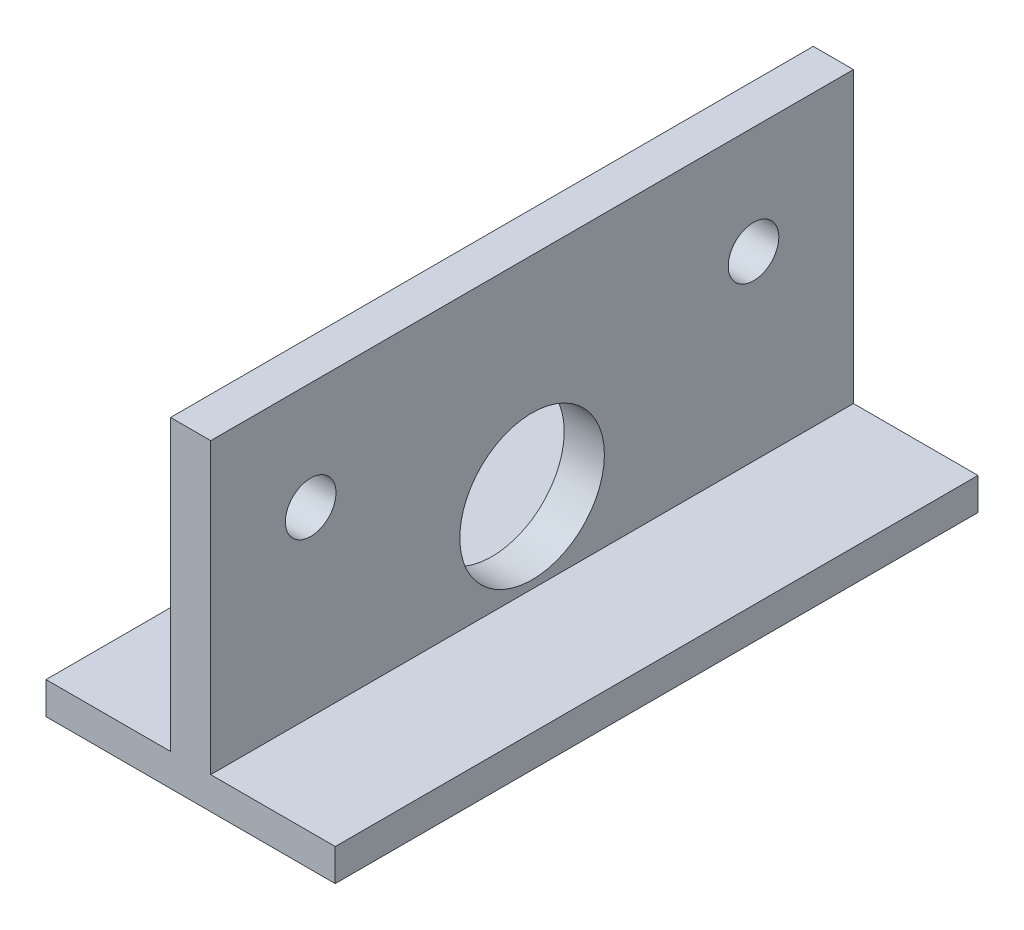
ISO-10303-21;
HEADER;
FILE_DESCRIPTION(('STEP AP214'),'2;1');
FILE_NAME('part.step','',(''),(''),'','','');
FILE_SCHEMA(('AUTOMOTIVE_DESIGN { 1 0 10303 214 1 1 1 1 }'));
ENDSEC;
DATA;
#1=APPLICATION_CONTEXT('core data for automotive mechanical design processes');
#2=APPLICATION_PROTOCOL_DEFINITION('international standard','automotive_design',2000,#1);
#3=PRODUCT_CONTEXT('',#1,'mechanical');
#4=PRODUCT('Part','Part','',(#3));
#5=PRODUCT_RELATED_PRODUCT_CATEGORY('part','',(#4));
#6=PRODUCT_DEFINITION_FORMATION('','',#4);
#7=PRODUCT_DEFINITION_CONTEXT('part definition',#1,'design');
#8=PRODUCT_DEFINITION('design','',#6,#7);
#9=PRODUCT_DEFINITION_SHAPE('','',#8);
#10=(LENGTH_UNIT() NAMED_UNIT(*) SI_UNIT(.MILLI.,.METRE.));
#11=(NAMED_UNIT(*) PLANE_ANGLE_UNIT() SI_UNIT($,.RADIAN.));
#12=(NAMED_UNIT(*) SI_UNIT($,.STERADIAN.) SOLID_ANGLE_UNIT());
#13=UNCERTAINTY_MEASURE_WITH_UNIT(LENGTH_MEASURE(1.E-05),#10,'distance_accuracy_value','');
#14=(GEOMETRIC_REPRESENTATION_CONTEXT(3) GLOBAL_UNCERTAINTY_ASSIGNED_CONTEXT((#13)) GLOBAL_UNIT_ASSIGNED_CONTEXT((#10,
#11,#12)) REPRESENTATION_CONTEXT('',''));
#15=CARTESIAN_POINT('',(0.,0.,0.));
#16=DIRECTION('',(0.,0.,1.));
#17=DIRECTION('',(1.,0.,0.));
#18=AXIS2_PLACEMENT_3D('',#15,#16,#17);
#19=CARTESIAN_POINT('',(1.5875,0.,0.));
#20=DIRECTION('',(-1.,0.,0.));
#21=DIRECTION('',(0.,0.,1.));
#22=AXIS2_PLACEMENT_3D('',#19,#20,#21);
#23=PLANE('',#22);
#24=CARTESIAN_POINT('',(1.5875,-3.81,0.));
#25=DIRECTION('',(1.,0.,0.));
#26=DIRECTION('',(0.,0.,-1.));
#27=AXIS2_PLACEMENT_3D('',#24,#25,#26);
#28=CIRCLE('',#27,5.715);
#29=CARTESIAN_POINT('',(1.5875,-3.81,-5.715));
#30=VERTEX_POINT('',#29);
#31=EDGE_CURVE('E133',#30,#30,#28,.T.);
#32=ORIENTED_EDGE('',*,*,#31,.F.);
#33=EDGE_LOOP('',(#32));
#34=FACE_BOUND('',#33,.T.);
#35=CARTESIAN_POINT('',(1.5875,4.191,-17.5006));
#36=DIRECTION('',(1.,0.,0.));
#37=DIRECTION('',(0.,0.,-1.));
#38=AXIS2_PLACEMENT_3D('',#35,#36,#37);
#39=CIRCLE('',#38,2.00025);
#40=CARTESIAN_POINT('',(1.5875,4.191,-19.50085));
#41=VERTEX_POINT('',#40);
#42=EDGE_CURVE('E139',#41,#41,#39,.T.);
#43=ORIENTED_EDGE('',*,*,#42,.F.);
#44=EDGE_LOOP('',(#43));
#45=FACE_BOUND('',#44,.T.);
#46=CARTESIAN_POINT('',(1.5875,4.191,17.5006));
#47=DIRECTION('',(1.,0.,0.));
#48=DIRECTION('',(0.,0.,-1.));
#49=AXIS2_PLACEMENT_3D('',#46,#47,#48);
#50=CIRCLE('',#49,2.00025);
#51=CARTESIAN_POINT('',(1.5875,4.191,15.50035));
#52=VERTEX_POINT('',#51);
#53=EDGE_CURVE('E145',#52,#52,#50,.T.);
#54=ORIENTED_EDGE('',*,*,#53,.F.);
#55=EDGE_LOOP('',(#54));
#56=FACE_BOUND('',#55,.T.);
#57=DIRECTION('',(0.,0.,1.));
#58=VECTOR('',#57,1.);
#59=CARTESIAN_POINT('',(1.5875,-10.16,0.));
#60=LINE('',#59,#58);
#61=CARTESIAN_POINT('',(1.5875,-10.16,-25.4));
#62=VERTEX_POINT('',#61);
#63=CARTESIAN_POINT('',(1.5875,-10.16,25.4));
#64=VERTEX_POINT('',#63);
#65=EDGE_CURVE('E52',#62,#64,#60,.T.);
#66=ORIENTED_EDGE('',*,*,#65,.F.);
#67=DIRECTION('',(0.,1.,0.));
#68=VECTOR('',#67,1.);
#69=CARTESIAN_POINT('',(1.5875,-12.7,-25.4));
#70=LINE('',#69,#68);
#71=CARTESIAN_POINT('',(1.5875,12.7,-25.4));
#72=VERTEX_POINT('',#71);
#73=EDGE_CURVE('E122',#62,#72,#70,.T.);
#74=ORIENTED_EDGE('',*,*,#73,.T.);
#75=DIRECTION('',(0.,0.,1.));
#76=VECTOR('',#75,1.);
#77=CARTESIAN_POINT('',(1.5875,12.7,25.4));
#78=LINE('',#77,#76);
#79=CARTESIAN_POINT('',(1.5875,12.7,25.4));
#80=VERTEX_POINT('',#79);
#81=EDGE_CURVE('E152',#72,#80,#78,.T.);
#82=ORIENTED_EDGE('',*,*,#81,.T.);
#83=DIRECTION('',(0.,-1.,0.));
#84=VECTOR('',#83,1.);
#85=CARTESIAN_POINT('',(1.5875,-12.7,25.4));
#86=LINE('',#85,#84);
#87=EDGE_CURVE('E57',#80,#64,#86,.T.);
#88=ORIENTED_EDGE('',*,*,#87,.T.);
#89=EDGE_LOOP('',(#66,#74,#82,#88));
#90=FACE_BOUND('',#89,.T.);
#91=ADVANCED_FACE('F37',(#34,#45,#56,#90),#23,.F.);
#92=CARTESIAN_POINT('',(-1.5875,0.,0.));
#93=DIRECTION('',(-1.,0.,0.));
#94=DIRECTION('',(0.,0.,1.));
#95=AXIS2_PLACEMENT_3D('',#92,#93,#94);
#96=PLANE('',#95);
#97=CARTESIAN_POINT('',(-1.5875,4.191,-17.5006));
#98=DIRECTION('',(1.,0.,0.));
#99=DIRECTION('',(0.,0.,-1.));
#100=AXIS2_PLACEMENT_3D('',#97,#98,#99);
#101=CIRCLE('',#100,2.00025);
#102=CARTESIAN_POINT('',(-1.5875,4.191,-19.50085));
#103=VERTEX_POINT('',#102);
#104=EDGE_CURVE('E136',#103,#103,#101,.T.);
#105=ORIENTED_EDGE('',*,*,#104,.T.);
#106=EDGE_LOOP('',(#105));
#107=FACE_BOUND('',#106,.T.);
#108=CARTESIAN_POINT('',(-1.5875,4.191,17.5006));
#109=DIRECTION('',(1.,0.,0.));
#110=DIRECTION('',(0.,0.,-1.));
#111=AXIS2_PLACEMENT_3D('',#108,#109,#110);
#112=CIRCLE('',#111,2.00025);
#113=CARTESIAN_POINT('',(-1.5875,4.191,15.50035));
#114=VERTEX_POINT('',#113);
#115=EDGE_CURVE('E142',#114,#114,#112,.T.);
#116=ORIENTED_EDGE('',*,*,#115,.T.);
#117=EDGE_LOOP('',(#116));
#118=FACE_BOUND('',#117,.T.);
#119=CARTESIAN_POINT('',(-1.5875,-3.81,0.));
#120=DIRECTION('',(1.,0.,0.));
#121=DIRECTION('',(0.,0.,-1.));
#122=AXIS2_PLACEMENT_3D('',#119,#120,#121);
#123=CIRCLE('',#122,5.715);
#124=CARTESIAN_POINT('',(-1.5875,-3.81,-5.715));
#125=VERTEX_POINT('',#124);
#126=EDGE_CURVE('E132',#125,#125,#123,.T.);
#127=ORIENTED_EDGE('',*,*,#126,.T.);
#128=EDGE_LOOP('',(#127));
#129=FACE_BOUND('',#128,.T.);
#130=DIRECTION('',(0.,1.,0.));
#131=VECTOR('',#130,1.);
#132=CARTESIAN_POINT('',(-1.5875,-12.7,-25.4));
#133=LINE('',#132,#131);
#134=CARTESIAN_POINT('',(-1.5875,-10.16,-25.4));
#135=VERTEX_POINT('',#134);
#136=CARTESIAN_POINT('',(-1.5875,12.7,-25.4));
#137=VERTEX_POINT('',#136);
#138=EDGE_CURVE('E148',#135,#137,#133,.T.);
#139=ORIENTED_EDGE('',*,*,#138,.F.);
#140=DIRECTION('',(0.,0.,1.));
#141=VECTOR('',#140,1.);
#142=CARTESIAN_POINT('',(-1.5875,-10.16,0.));
#143=LINE('',#142,#141);
#144=CARTESIAN_POINT('',(-1.5875,-10.16,25.4));
#145=VERTEX_POINT('',#144);
#146=EDGE_CURVE('E123',#135,#145,#143,.T.);
#147=ORIENTED_EDGE('',*,*,#146,.T.);
#148=DIRECTION('',(0.,-1.,0.));
#149=VECTOR('',#148,1.);
#150=CARTESIAN_POINT('',(-1.5875,-12.7,25.4));
#151=LINE('',#150,#149);
#152=CARTESIAN_POINT('',(-1.5875,12.7,25.4));
#153=VERTEX_POINT('',#152);
#154=EDGE_CURVE('E153',#153,#145,#151,.T.);
#155=ORIENTED_EDGE('',*,*,#154,.F.);
#156=DIRECTION('',(0.,0.,1.));
#157=VECTOR('',#156,1.);
#158=CARTESIAN_POINT('',(-1.5875,12.7,25.4));
#159=LINE('',#158,#157);
#160=EDGE_CURVE('E158',#137,#153,#159,.T.);
#161=ORIENTED_EDGE('',*,*,#160,.F.);
#162=EDGE_LOOP('',(#139,#147,#155,#161));
#163=FACE_BOUND('',#162,.T.);
#164=ADVANCED_FACE('F174',(#107,#118,#129,#163),#96,.T.);
#165=CARTESIAN_POINT('',(1.5875,-12.7,-25.4));
#166=DIRECTION('',(0.,0.,1.));
#167=DIRECTION('',(1.,0.,0.));
#168=AXIS2_PLACEMENT_3D('',#165,#166,#167);
#169=PLANE('',#168);
#170=DIRECTION('',(-1.,0.,0.));
#171=VECTOR('',#170,1.);
#172=CARTESIAN_POINT('',(1.5875,-12.7,-25.4));
#173=LINE('',#172,#171);
#174=CARTESIAN_POINT('',(11.43,-12.7,-25.4));
#175=VERTEX_POINT('',#174);
#176=CARTESIAN_POINT('',(-11.43,-12.7,-25.4));
#177=VERTEX_POINT('',#176);
#178=EDGE_CURVE('E156',#175,#177,#173,.T.);
#179=ORIENTED_EDGE('',*,*,#178,.T.);
#180=DIRECTION('',(0.,1.,0.));
#181=VECTOR('',#180,1.);
#182=CARTESIAN_POINT('',(-11.43,-10.16,-25.4));
#183=LINE('',#182,#181);
#184=CARTESIAN_POINT('',(-11.43,-10.16,-25.4));
#185=VERTEX_POINT('',#184);
#186=EDGE_CURVE('E183',#177,#185,#183,.T.);
#187=ORIENTED_EDGE('',*,*,#186,.T.);
#188=DIRECTION('',(-1.,0.,0.));
#189=VECTOR('',#188,1.);
#190=CARTESIAN_POINT('',(11.43,-10.16,-25.4));
#191=LINE('',#190,#189);
#192=EDGE_CURVE('E124',#135,#185,#191,.T.);
#193=ORIENTED_EDGE('',*,*,#192,.F.);
#194=ORIENTED_EDGE('',*,*,#138,.T.);
#195=DIRECTION('',(-1.,0.,0.));
#196=VECTOR('',#195,1.);
#197=CARTESIAN_POINT('',(1.5875,12.7,-25.4));
#198=LINE('',#197,#196);
#199=EDGE_CURVE('E11',#72,#137,#198,.T.);
#200=ORIENTED_EDGE('',*,*,#199,.F.);
#201=ORIENTED_EDGE('',*,*,#73,.F.);
#202=CARTESIAN_POINT('',(11.43,-10.16,-25.4));
#203=VERTEX_POINT('',#202);
#204=EDGE_CURVE('E104',#203,#62,#191,.T.);
#205=ORIENTED_EDGE('',*,*,#204,.F.);
#206=DIRECTION('',(0.,1.,0.));
#207=VECTOR('',#206,1.);
#208=CARTESIAN_POINT('',(11.43,-10.16,-25.4));
#209=LINE('',#208,#207);
#210=EDGE_CURVE('E111',#175,#203,#209,.T.);
#211=ORIENTED_EDGE('',*,*,#210,.F.);
#212=EDGE_LOOP('',(#179,#187,#193,#194,#200,#201,#205,#211));
#213=FACE_BOUND('',#212,.T.);
#214=ADVANCED_FACE('F39',(#213),#169,.F.);
#215=CARTESIAN_POINT('',(1.5875,12.7,25.4));
#216=DIRECTION('',(0.,-1.,0.));
#217=DIRECTION('',(0.,0.,-1.));
#218=AXIS2_PLACEMENT_3D('',#215,#216,#217);
#219=PLANE('',#218);
#220=ORIENTED_EDGE('',*,*,#160,.T.);
#221=DIRECTION('',(-1.,0.,0.));
#222=VECTOR('',#221,1.);
#223=CARTESIAN_POINT('',(1.5875,12.7,25.4));
#224=LINE('',#223,#222);
#225=EDGE_CURVE('E45',#80,#153,#224,.T.);
#226=ORIENTED_EDGE('',*,*,#225,.F.);
#227=ORIENTED_EDGE('',*,*,#81,.F.);
#228=ORIENTED_EDGE('',*,*,#199,.T.);
#229=EDGE_LOOP('',(#220,#226,#227,#228));
#230=FACE_BOUND('',#229,.T.);
#231=ADVANCED_FACE('F228',(#230),#219,.F.);
#232=CARTESIAN_POINT('',(1.5875,-12.7,25.4));
#233=DIRECTION('',(0.,0.,-1.));
#234=DIRECTION('',(-1.,0.,0.));
#235=AXIS2_PLACEMENT_3D('',#232,#233,#234);
#236=PLANE('',#235);
#237=DIRECTION('',(-1.,0.,0.));
#238=VECTOR('',#237,1.);
#239=CARTESIAN_POINT('',(1.5875,-12.7,25.4));
#240=LINE('',#239,#238);
#241=CARTESIAN_POINT('',(11.43,-12.7,25.4));
#242=VERTEX_POINT('',#241);
#243=CARTESIAN_POINT('',(-11.43,-12.7,25.4));
#244=VERTEX_POINT('',#243);
#245=EDGE_CURVE('E163',#242,#244,#240,.T.);
#246=ORIENTED_EDGE('',*,*,#245,.F.);
#247=DIRECTION('',(0.,-1.,0.));
#248=VECTOR('',#247,1.);
#249=CARTESIAN_POINT('',(11.43,-10.16,25.4));
#250=LINE('',#249,#248);
#251=CARTESIAN_POINT('',(11.43,-10.16,25.4));
#252=VERTEX_POINT('',#251);
#253=EDGE_CURVE('E110',#252,#242,#250,.T.);
#254=ORIENTED_EDGE('',*,*,#253,.F.);
#255=DIRECTION('',(-1.,0.,0.));
#256=VECTOR('',#255,1.);
#257=CARTESIAN_POINT('',(11.43,-10.16,25.4));
#258=LINE('',#257,#256);
#259=EDGE_CURVE('E106',#252,#64,#258,.T.);
#260=ORIENTED_EDGE('',*,*,#259,.T.);
#261=ORIENTED_EDGE('',*,*,#87,.F.);
#262=ORIENTED_EDGE('',*,*,#225,.T.);
#263=ORIENTED_EDGE('',*,*,#154,.T.);
#264=CARTESIAN_POINT('',(-11.43,-10.16,25.4));
#265=VERTEX_POINT('',#264);
#266=EDGE_CURVE('E180',#145,#265,#258,.T.);
#267=ORIENTED_EDGE('',*,*,#266,.T.);
#268=DIRECTION('',(0.,-1.,0.));
#269=VECTOR('',#268,1.);
#270=CARTESIAN_POINT('',(-11.43,-10.16,25.4));
#271=LINE('',#270,#269);
#272=EDGE_CURVE('E189',#265,#244,#271,.T.);
#273=ORIENTED_EDGE('',*,*,#272,.T.);
#274=EDGE_LOOP('',(#246,#254,#260,#261,#262,#263,#267,#273));
#275=FACE_BOUND('',#274,.T.);
#276=ADVANCED_FACE('F168',(#275),#236,.F.);
#277=CARTESIAN_POINT('',(1.5875,-12.7,25.4));
#278=DIRECTION('',(0.,1.,0.));
#279=DIRECTION('',(0.,0.,1.));
#280=AXIS2_PLACEMENT_3D('',#277,#278,#279);
#281=PLANE('',#280);
#282=ORIENTED_EDGE('',*,*,#245,.T.);
#283=DIRECTION('',(0.,0.,-1.));
#284=VECTOR('',#283,1.);
#285=CARTESIAN_POINT('',(-11.43,-12.7,25.4));
#286=LINE('',#285,#284);
#287=EDGE_CURVE('E119',#244,#177,#286,.T.);
#288=ORIENTED_EDGE('',*,*,#287,.T.);
#289=ORIENTED_EDGE('',*,*,#178,.F.);
#290=DIRECTION('',(0.,0.,-1.));
#291=VECTOR('',#290,1.);
#292=CARTESIAN_POINT('',(11.43,-12.7,25.4));
#293=LINE('',#292,#291);
#294=EDGE_CURVE('E117',#242,#175,#293,.T.);
#295=ORIENTED_EDGE('',*,*,#294,.F.);
#296=EDGE_LOOP('',(#282,#288,#289,#295));
#297=FACE_BOUND('',#296,.T.);
#298=ADVANCED_FACE('F196',(#297),#281,.F.);
#299=CARTESIAN_POINT('',(1.5875,4.191,17.5006));
#300=DIRECTION('',(-1.,0.,0.));
#301=DIRECTION('',(0.,0.,1.));
#302=AXIS2_PLACEMENT_3D('',#299,#300,#301);
#303=CYLINDRICAL_SURFACE('',#302,2.00025);
#304=ORIENTED_EDGE('',*,*,#53,.T.);
#305=EDGE_LOOP('',(#304));
#306=FACE_BOUND('',#305,.T.);
#307=ORIENTED_EDGE('',*,*,#115,.F.);
#308=EDGE_LOOP('',(#307));
#309=FACE_BOUND('',#308,.T.);
#310=ADVANCED_FACE('F222',(#306,#309),#303,.F.);
#311=CARTESIAN_POINT('',(1.5875,4.191,-17.5006));
#312=DIRECTION('',(-1.,0.,0.));
#313=DIRECTION('',(0.,0.,1.));
#314=AXIS2_PLACEMENT_3D('',#311,#312,#313);
#315=CYLINDRICAL_SURFACE('',#314,2.00025);
#316=ORIENTED_EDGE('',*,*,#42,.T.);
#317=EDGE_LOOP('',(#316));
#318=FACE_BOUND('',#317,.T.);
#319=ORIENTED_EDGE('',*,*,#104,.F.);
#320=EDGE_LOOP('',(#319));
#321=FACE_BOUND('',#320,.T.);
#322=ADVANCED_FACE('F207',(#318,#321),#315,.F.);
#323=CARTESIAN_POINT('',(1.5875,-3.81,0.));
#324=DIRECTION('',(-1.,0.,0.));
#325=DIRECTION('',(0.,0.,1.));
#326=AXIS2_PLACEMENT_3D('',#323,#324,#325);
#327=CYLINDRICAL_SURFACE('',#326,5.715);
#328=ORIENTED_EDGE('',*,*,#31,.T.);
#329=EDGE_LOOP('',(#328));
#330=FACE_BOUND('',#329,.T.);
#331=ORIENTED_EDGE('',*,*,#126,.F.);
#332=EDGE_LOOP('',(#331));
#333=FACE_BOUND('',#332,.T.);
#334=ADVANCED_FACE('F200',(#330,#333),#327,.F.);
#335=CARTESIAN_POINT('',(-11.43,0.,0.));
#336=DIRECTION('',(1.,0.,0.));
#337=DIRECTION('',(0.,0.,-1.));
#338=AXIS2_PLACEMENT_3D('',#335,#336,#337);
#339=PLANE('',#338);
#340=ORIENTED_EDGE('',*,*,#186,.F.);
#341=ORIENTED_EDGE('',*,*,#287,.F.);
#342=ORIENTED_EDGE('',*,*,#272,.F.);
#343=DIRECTION('',(0.,0.,1.));
#344=VECTOR('',#343,1.);
#345=CARTESIAN_POINT('',(-11.43,-10.16,25.4));
#346=LINE('',#345,#344);
#347=EDGE_CURVE('E187',#185,#265,#346,.T.);
#348=ORIENTED_EDGE('',*,*,#347,.F.);
#349=EDGE_LOOP('',(#340,#341,#342,#348));
#350=FACE_BOUND('',#349,.T.);
#351=ADVANCED_FACE('F198',(#350),#339,.F.);
#352=CARTESIAN_POINT('',(11.43,-10.16,25.4));
#353=DIRECTION('',(0.,-1.,0.));
#354=DIRECTION('',(0.,0.,-1.));
#355=AXIS2_PLACEMENT_3D('',#352,#353,#354);
#356=PLANE('',#355);
#357=ORIENTED_EDGE('',*,*,#146,.F.);
#358=ORIENTED_EDGE('',*,*,#192,.T.);
#359=ORIENTED_EDGE('',*,*,#347,.T.);
#360=ORIENTED_EDGE('',*,*,#266,.F.);
#361=EDGE_LOOP('',(#357,#358,#359,#360));
#362=FACE_BOUND('',#361,.T.);
#363=ADVANCED_FACE('F177',(#362),#356,.F.);
#364=ORIENTED_EDGE('',*,*,#204,.T.);
#365=ORIENTED_EDGE('',*,*,#65,.T.);
#366=ORIENTED_EDGE('',*,*,#259,.F.);
#367=DIRECTION('',(0.,0.,1.));
#368=VECTOR('',#367,1.);
#369=CARTESIAN_POINT('',(11.43,-10.16,25.4));
#370=LINE('',#369,#368);
#371=EDGE_CURVE('E100',#203,#252,#370,.T.);
#372=ORIENTED_EDGE('',*,*,#371,.F.);
#373=EDGE_LOOP('',(#364,#365,#366,#372));
#374=FACE_BOUND('',#373,.T.);
#375=ADVANCED_FACE('F102',(#374),#356,.F.);
#376=CARTESIAN_POINT('',(11.43,0.,0.));
#377=DIRECTION('',(1.,0.,0.));
#378=DIRECTION('',(0.,0.,-1.));
#379=AXIS2_PLACEMENT_3D('',#376,#377,#378);
#380=PLANE('',#379);
#381=ORIENTED_EDGE('',*,*,#210,.T.);
#382=ORIENTED_EDGE('',*,*,#371,.T.);
#383=ORIENTED_EDGE('',*,*,#253,.T.);
#384=ORIENTED_EDGE('',*,*,#294,.T.);
#385=EDGE_LOOP('',(#381,#382,#383,#384));
#386=FACE_BOUND('',#385,.T.);
#387=ADVANCED_FACE('F115',(#386),#380,.T.);
#388=CLOSED_SHELL('',(#91,#164,#214,#231,#276,#298,#310,#322,#334,#351,#363,#375,#387));
#389=MANIFOLD_SOLID_BREP('B2',#388);
#390=ADVANCED_BREP_SHAPE_REPRESENTATION('',(#18,#389),#14);
#391=SHAPE_DEFINITION_REPRESENTATION(#9,#390);
ENDSEC;
END-ISO-10303-21;
